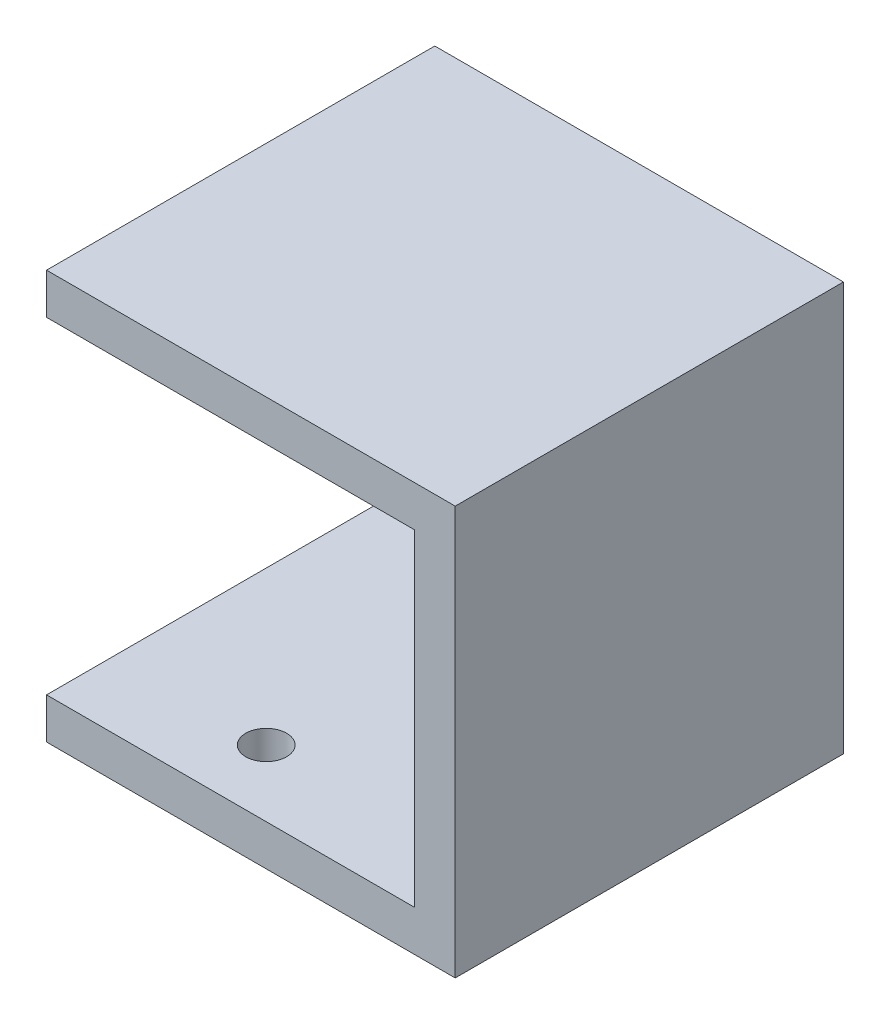
ISO-10303-21;
HEADER;
FILE_DESCRIPTION(('STEP AP214'),'2;1');
FILE_NAME('part.step','',(''),(''),'','','');
FILE_SCHEMA(('AUTOMOTIVE_DESIGN { 1 0 10303 214 1 1 1 1 }'));
ENDSEC;
DATA;
#1=APPLICATION_CONTEXT('core data for automotive mechanical design processes');
#2=APPLICATION_PROTOCOL_DEFINITION('international standard','automotive_design',2000,#1);
#3=PRODUCT_CONTEXT('',#1,'mechanical');
#4=PRODUCT('Part','Part','',(#3));
#5=PRODUCT_RELATED_PRODUCT_CATEGORY('part','',(#4));
#6=PRODUCT_DEFINITION_FORMATION('','',#4);
#7=PRODUCT_DEFINITION_CONTEXT('part definition',#1,'design');
#8=PRODUCT_DEFINITION('design','',#6,#7);
#9=PRODUCT_DEFINITION_SHAPE('','',#8);
#10=(LENGTH_UNIT() NAMED_UNIT(*) SI_UNIT(.MILLI.,.METRE.));
#11=(NAMED_UNIT(*) PLANE_ANGLE_UNIT() SI_UNIT($,.RADIAN.));
#12=(NAMED_UNIT(*) SI_UNIT($,.STERADIAN.) SOLID_ANGLE_UNIT());
#13=UNCERTAINTY_MEASURE_WITH_UNIT(LENGTH_MEASURE(1.E-05),#10,'distance_accuracy_value','');
#14=(GEOMETRIC_REPRESENTATION_CONTEXT(3) GLOBAL_UNCERTAINTY_ASSIGNED_CONTEXT((#13)) GLOBAL_UNIT_ASSIGNED_CONTEXT((#10,
#11,#12)) REPRESENTATION_CONTEXT('',''));
#15=CARTESIAN_POINT('',(0.,0.,0.));
#16=DIRECTION('',(0.,0.,1.));
#17=DIRECTION('',(1.,0.,0.));
#18=AXIS2_PLACEMENT_3D('',#15,#16,#17);
#19=CARTESIAN_POINT('',(0.,2.,38.));
#20=DIRECTION('',(0.,1.,0.));
#21=DIRECTION('',(-1.,0.,0.));
#22=AXIS2_PLACEMENT_3D('',#19,#20,#21);
#23=PLANE('',#22);
#24=DIRECTION('',(1.,0.,0.));
#25=VECTOR('',#24,1.);
#26=CARTESIAN_POINT('',(0.,2.,0.));
#27=LINE('',#26,#25);
#28=CARTESIAN_POINT('',(-20.,2.,0.));
#29=VERTEX_POINT('',#28);
#30=CARTESIAN_POINT('',(16.,2.,0.));
#31=VERTEX_POINT('',#30);
#32=EDGE_CURVE('E166',#29,#31,#27,.T.);
#33=ORIENTED_EDGE('',*,*,#32,.F.);
#34=DIRECTION('',(0.,0.,-1.));
#35=VECTOR('',#34,1.);
#36=CARTESIAN_POINT('',(-20.,2.,38.));
#37=LINE('',#36,#35);
#38=CARTESIAN_POINT('',(-20.,2.,38.));
#39=VERTEX_POINT('',#38);
#40=EDGE_CURVE('E128',#39,#29,#37,.T.);
#41=ORIENTED_EDGE('',*,*,#40,.F.);
#42=DIRECTION('',(1.,0.,0.));
#43=VECTOR('',#42,1.);
#44=CARTESIAN_POINT('',(0.,2.,38.));
#45=LINE('',#44,#43);
#46=CARTESIAN_POINT('',(16.,2.,38.));
#47=VERTEX_POINT('',#46);
#48=EDGE_CURVE('E140',#39,#47,#45,.T.);
#49=ORIENTED_EDGE('',*,*,#48,.T.);
#50=DIRECTION('',(0.,0.,-1.));
#51=VECTOR('',#50,1.);
#52=CARTESIAN_POINT('',(16.,2.,38.));
#53=LINE('',#52,#51);
#54=EDGE_CURVE('E184',#47,#31,#53,.T.);
#55=ORIENTED_EDGE('',*,*,#54,.T.);
#56=EDGE_LOOP('',(#33,#41,#49,#55));
#57=FACE_BOUND('',#56,.T.);
#58=CARTESIAN_POINT('',(-5.,2.,31.5));
#59=DIRECTION('',(0.,1.,0.));
#60=DIRECTION('',(-1.,0.,0.));
#61=AXIS2_PLACEMENT_3D('',#58,#59,#60);
#62=CIRCLE('',#61,2.);
#63=CARTESIAN_POINT('',(-7.00000000000001,2.,31.5));
#64=VERTEX_POINT('',#63);
#65=EDGE_CURVE('E219',#64,#64,#62,.T.);
#66=ORIENTED_EDGE('',*,*,#65,.F.);
#67=EDGE_LOOP('',(#66));
#68=FACE_BOUND('',#67,.T.);
#69=CARTESIAN_POINT('',(-5.,2.,6.5));
#70=DIRECTION('',(0.,1.,0.));
#71=DIRECTION('',(-1.,0.,0.));
#72=AXIS2_PLACEMENT_3D('',#69,#70,#71);
#73=CIRCLE('',#72,2.);
#74=CARTESIAN_POINT('',(-7.,2.,6.5));
#75=VERTEX_POINT('',#74);
#76=EDGE_CURVE('E155',#75,#75,#73,.F.);
#77=ORIENTED_EDGE('',*,*,#76,.T.);
#78=EDGE_LOOP('',(#77));
#79=FACE_BOUND('',#78,.T.);
#80=ADVANCED_FACE('F47',(#57,#68,#79),#23,.T.);
#81=CARTESIAN_POINT('',(0.,-2.,38.));
#82=DIRECTION('',(0.,1.,0.));
#83=DIRECTION('',(-1.,0.,0.));
#84=AXIS2_PLACEMENT_3D('',#81,#82,#83);
#85=PLANE('',#84);
#86=CARTESIAN_POINT('',(-5.,-2.,31.5));
#87=DIRECTION('',(0.,-1.,0.));
#88=DIRECTION('',(1.,0.,0.));
#89=AXIS2_PLACEMENT_3D('',#86,#87,#88);
#90=CIRCLE('',#89,2.);
#91=CARTESIAN_POINT('',(-3.,-2.,31.5));
#92=VERTEX_POINT('',#91);
#93=EDGE_CURVE('E224',#92,#92,#90,.T.);
#94=ORIENTED_EDGE('',*,*,#93,.F.);
#95=EDGE_LOOP('',(#94));
#96=FACE_BOUND('',#95,.T.);
#97=DIRECTION('',(1.,0.,0.));
#98=VECTOR('',#97,1.);
#99=CARTESIAN_POINT('',(0.,-2.,0.));
#100=LINE('',#99,#98);
#101=CARTESIAN_POINT('',(-20.,-2.,0.));
#102=VERTEX_POINT('',#101);
#103=CARTESIAN_POINT('',(20.,-2.,0.));
#104=VERTEX_POINT('',#103);
#105=EDGE_CURVE('E92',#102,#104,#100,.T.);
#106=ORIENTED_EDGE('',*,*,#105,.T.);
#107=DIRECTION('',(0.,0.,-1.));
#108=VECTOR('',#107,1.);
#109=CARTESIAN_POINT('',(20.,-2.,38.));
#110=LINE('',#109,#108);
#111=CARTESIAN_POINT('',(20.,-2.,38.));
#112=VERTEX_POINT('',#111);
#113=EDGE_CURVE('E129',#112,#104,#110,.T.);
#114=ORIENTED_EDGE('',*,*,#113,.F.);
#115=DIRECTION('',(1.,0.,0.));
#116=VECTOR('',#115,1.);
#117=CARTESIAN_POINT('',(0.,-2.,38.));
#118=LINE('',#117,#116);
#119=CARTESIAN_POINT('',(-20.,-2.,38.));
#120=VERTEX_POINT('',#119);
#121=EDGE_CURVE('E131',#120,#112,#118,.T.);
#122=ORIENTED_EDGE('',*,*,#121,.F.);
#123=DIRECTION('',(0.,0.,-1.));
#124=VECTOR('',#123,1.);
#125=CARTESIAN_POINT('',(-20.,-2.,38.));
#126=LINE('',#125,#124);
#127=EDGE_CURVE('E120',#120,#102,#126,.T.);
#128=ORIENTED_EDGE('',*,*,#127,.T.);
#129=EDGE_LOOP('',(#106,#114,#122,#128));
#130=FACE_BOUND('',#129,.T.);
#131=CARTESIAN_POINT('',(-5.,-2.,6.5));
#132=DIRECTION('',(0.,-1.,0.));
#133=DIRECTION('',(1.,0.,0.));
#134=AXIS2_PLACEMENT_3D('',#131,#132,#133);
#135=CIRCLE('',#134,2.);
#136=CARTESIAN_POINT('',(-3.,-2.,6.5));
#137=VERTEX_POINT('',#136);
#138=EDGE_CURVE('E223',#137,#137,#135,.F.);
#139=ORIENTED_EDGE('',*,*,#138,.T.);
#140=EDGE_LOOP('',(#139));
#141=FACE_BOUND('',#140,.T.);
#142=ADVANCED_FACE('F132',(#96,#130,#141),#85,.F.);
#143=CARTESIAN_POINT('',(0.,38.,38.));
#144=DIRECTION('',(0.,1.,0.));
#145=DIRECTION('',(-1.,0.,0.));
#146=AXIS2_PLACEMENT_3D('',#143,#144,#145);
#147=PLANE('',#146);
#148=DIRECTION('',(1.,0.,0.));
#149=VECTOR('',#148,1.);
#150=CARTESIAN_POINT('',(0.,38.,0.));
#151=LINE('',#150,#149);
#152=CARTESIAN_POINT('',(-20.,38.,0.));
#153=VERTEX_POINT('',#152);
#154=CARTESIAN_POINT('',(20.,38.,0.));
#155=VERTEX_POINT('',#154);
#156=EDGE_CURVE('E150',#153,#155,#151,.T.);
#157=ORIENTED_EDGE('',*,*,#156,.F.);
#158=DIRECTION('',(0.,0.,-1.));
#159=VECTOR('',#158,1.);
#160=CARTESIAN_POINT('',(-20.,38.,38.));
#161=LINE('',#160,#159);
#162=CARTESIAN_POINT('',(-20.,38.,38.));
#163=VERTEX_POINT('',#162);
#164=EDGE_CURVE('E11',#163,#153,#161,.T.);
#165=ORIENTED_EDGE('',*,*,#164,.F.);
#166=DIRECTION('',(1.,0.,0.));
#167=VECTOR('',#166,1.);
#168=CARTESIAN_POINT('',(0.,38.,38.));
#169=LINE('',#168,#167);
#170=CARTESIAN_POINT('',(20.,38.,38.));
#171=VERTEX_POINT('',#170);
#172=EDGE_CURVE('E177',#163,#171,#169,.T.);
#173=ORIENTED_EDGE('',*,*,#172,.T.);
#174=DIRECTION('',(0.,0.,-1.));
#175=VECTOR('',#174,1.);
#176=CARTESIAN_POINT('',(20.,38.,38.));
#177=LINE('',#176,#175);
#178=EDGE_CURVE('E99',#171,#155,#177,.T.);
#179=ORIENTED_EDGE('',*,*,#178,.T.);
#180=EDGE_LOOP('',(#157,#165,#173,#179));
#181=FACE_BOUND('',#180,.T.);
#182=ADVANCED_FACE('F49',(#181),#147,.T.);
#183=CARTESIAN_POINT('',(-20.,0.,38.));
#184=DIRECTION('',(1.,0.,0.));
#185=DIRECTION('',(0.,0.,-1.));
#186=AXIS2_PLACEMENT_3D('',#183,#184,#185);
#187=PLANE('',#186);
#188=DIRECTION('',(0.,-1.,0.));
#189=VECTOR('',#188,1.);
#190=CARTESIAN_POINT('',(-20.,0.,0.));
#191=LINE('',#190,#189);
#192=CARTESIAN_POINT('',(-20.,34.,0.));
#193=VERTEX_POINT('',#192);
#194=EDGE_CURVE('E154',#153,#193,#191,.T.);
#195=ORIENTED_EDGE('',*,*,#194,.T.);
#196=DIRECTION('',(0.,0.,-1.));
#197=VECTOR('',#196,1.);
#198=CARTESIAN_POINT('',(-20.,34.,38.));
#199=LINE('',#198,#197);
#200=CARTESIAN_POINT('',(-20.,34.,38.));
#201=VERTEX_POINT('',#200);
#202=EDGE_CURVE('E57',#201,#193,#199,.T.);
#203=ORIENTED_EDGE('',*,*,#202,.F.);
#204=DIRECTION('',(0.,-1.,0.));
#205=VECTOR('',#204,1.);
#206=CARTESIAN_POINT('',(-20.,0.,38.));
#207=LINE('',#206,#205);
#208=EDGE_CURVE('E209',#163,#201,#207,.T.);
#209=ORIENTED_EDGE('',*,*,#208,.F.);
#210=ORIENTED_EDGE('',*,*,#164,.T.);
#211=EDGE_LOOP('',(#195,#203,#209,#210));
#212=FACE_BOUND('',#211,.T.);
#213=ADVANCED_FACE('F258',(#212),#187,.F.);
#214=CARTESIAN_POINT('',(0.,34.,38.));
#215=DIRECTION('',(0.,1.,0.));
#216=DIRECTION('',(-1.,0.,0.));
#217=AXIS2_PLACEMENT_3D('',#214,#215,#216);
#218=PLANE('',#217);
#219=DIRECTION('',(1.,0.,0.));
#220=VECTOR('',#219,1.);
#221=CARTESIAN_POINT('',(0.,34.,0.));
#222=LINE('',#221,#220);
#223=CARTESIAN_POINT('',(16.,34.,0.));
#224=VERTEX_POINT('',#223);
#225=EDGE_CURVE('E158',#193,#224,#222,.T.);
#226=ORIENTED_EDGE('',*,*,#225,.T.);
#227=DIRECTION('',(0.,0.,-1.));
#228=VECTOR('',#227,1.);
#229=CARTESIAN_POINT('',(16.,34.,38.));
#230=LINE('',#229,#228);
#231=CARTESIAN_POINT('',(16.,34.,38.));
#232=VERTEX_POINT('',#231);
#233=EDGE_CURVE('E187',#232,#224,#230,.T.);
#234=ORIENTED_EDGE('',*,*,#233,.F.);
#235=DIRECTION('',(1.,0.,0.));
#236=VECTOR('',#235,1.);
#237=CARTESIAN_POINT('',(0.,34.,38.));
#238=LINE('',#237,#236);
#239=EDGE_CURVE('E197',#201,#232,#238,.T.);
#240=ORIENTED_EDGE('',*,*,#239,.F.);
#241=ORIENTED_EDGE('',*,*,#202,.T.);
#242=EDGE_LOOP('',(#226,#234,#240,#241));
#243=FACE_BOUND('',#242,.T.);
#244=ADVANCED_FACE('F195',(#243),#218,.F.);
#245=CARTESIAN_POINT('',(16.,0.,38.));
#246=DIRECTION('',(-1.,0.,0.));
#247=DIRECTION('',(0.,0.,1.));
#248=AXIS2_PLACEMENT_3D('',#245,#246,#247);
#249=PLANE('',#248);
#250=DIRECTION('',(0.,1.,0.));
#251=VECTOR('',#250,1.);
#252=CARTESIAN_POINT('',(16.,0.,0.));
#253=LINE('',#252,#251);
#254=EDGE_CURVE('E162',#31,#224,#253,.T.);
#255=ORIENTED_EDGE('',*,*,#254,.F.);
#256=ORIENTED_EDGE('',*,*,#54,.F.);
#257=DIRECTION('',(0.,1.,0.));
#258=VECTOR('',#257,1.);
#259=CARTESIAN_POINT('',(16.,0.,38.));
#260=LINE('',#259,#258);
#261=EDGE_CURVE('E144',#47,#232,#260,.T.);
#262=ORIENTED_EDGE('',*,*,#261,.T.);
#263=ORIENTED_EDGE('',*,*,#233,.T.);
#264=EDGE_LOOP('',(#255,#256,#262,#263));
#265=FACE_BOUND('',#264,.T.);
#266=ADVANCED_FACE('F205',(#265),#249,.T.);
#267=CARTESIAN_POINT('',(-20.,0.,38.));
#268=DIRECTION('',(-1.,0.,0.));
#269=DIRECTION('',(0.,0.,1.));
#270=AXIS2_PLACEMENT_3D('',#267,#268,#269);
#271=PLANE('',#270);
#272=DIRECTION('',(0.,1.,0.));
#273=VECTOR('',#272,1.);
#274=CARTESIAN_POINT('',(-20.,0.,0.));
#275=LINE('',#274,#273);
#276=EDGE_CURVE('E126',#102,#29,#275,.T.);
#277=ORIENTED_EDGE('',*,*,#276,.F.);
#278=ORIENTED_EDGE('',*,*,#127,.F.);
#279=DIRECTION('',(0.,1.,0.));
#280=VECTOR('',#279,1.);
#281=CARTESIAN_POINT('',(-20.,0.,38.));
#282=LINE('',#281,#280);
#283=EDGE_CURVE('E124',#120,#39,#282,.T.);
#284=ORIENTED_EDGE('',*,*,#283,.T.);
#285=ORIENTED_EDGE('',*,*,#40,.T.);
#286=EDGE_LOOP('',(#277,#278,#284,#285));
#287=FACE_BOUND('',#286,.T.);
#288=ADVANCED_FACE('F122',(#287),#271,.T.);
#289=CARTESIAN_POINT('',(20.,0.,38.));
#290=DIRECTION('',(-1.,0.,0.));
#291=DIRECTION('',(0.,0.,1.));
#292=AXIS2_PLACEMENT_3D('',#289,#290,#291);
#293=PLANE('',#292);
#294=DIRECTION('',(0.,1.,0.));
#295=VECTOR('',#294,1.);
#296=CARTESIAN_POINT('',(20.,0.,0.));
#297=LINE('',#296,#295);
#298=EDGE_CURVE('E174',#104,#155,#297,.T.);
#299=ORIENTED_EDGE('',*,*,#298,.T.);
#300=ORIENTED_EDGE('',*,*,#178,.F.);
#301=DIRECTION('',(0.,1.,0.));
#302=VECTOR('',#301,1.);
#303=CARTESIAN_POINT('',(20.,0.,38.));
#304=LINE('',#303,#302);
#305=EDGE_CURVE('E65',#112,#171,#304,.T.);
#306=ORIENTED_EDGE('',*,*,#305,.F.);
#307=ORIENTED_EDGE('',*,*,#113,.T.);
#308=EDGE_LOOP('',(#299,#300,#306,#307));
#309=FACE_BOUND('',#308,.T.);
#310=ADVANCED_FACE('F265',(#309),#293,.F.);
#311=CARTESIAN_POINT('',(0.,0.,38.));
#312=DIRECTION('',(0.,0.,1.));
#313=DIRECTION('',(1.,0.,0.));
#314=AXIS2_PLACEMENT_3D('',#311,#312,#313);
#315=PLANE('',#314);
#316=ORIENTED_EDGE('',*,*,#172,.F.);
#317=ORIENTED_EDGE('',*,*,#208,.T.);
#318=ORIENTED_EDGE('',*,*,#239,.T.);
#319=ORIENTED_EDGE('',*,*,#261,.F.);
#320=ORIENTED_EDGE('',*,*,#48,.F.);
#321=ORIENTED_EDGE('',*,*,#283,.F.);
#322=ORIENTED_EDGE('',*,*,#121,.T.);
#323=ORIENTED_EDGE('',*,*,#305,.T.);
#324=EDGE_LOOP('',(#316,#317,#318,#319,#320,#321,#322,#323));
#325=FACE_BOUND('',#324,.T.);
#326=ADVANCED_FACE('F137',(#325),#315,.T.);
#327=CARTESIAN_POINT('',(0.,0.,0.));
#328=DIRECTION('',(0.,0.,1.));
#329=DIRECTION('',(1.,0.,0.));
#330=AXIS2_PLACEMENT_3D('',#327,#328,#329);
#331=PLANE('',#330);
#332=ORIENTED_EDGE('',*,*,#156,.T.);
#333=ORIENTED_EDGE('',*,*,#298,.F.);
#334=ORIENTED_EDGE('',*,*,#105,.F.);
#335=ORIENTED_EDGE('',*,*,#276,.T.);
#336=ORIENTED_EDGE('',*,*,#32,.T.);
#337=ORIENTED_EDGE('',*,*,#254,.T.);
#338=ORIENTED_EDGE('',*,*,#225,.F.);
#339=ORIENTED_EDGE('',*,*,#194,.F.);
#340=EDGE_LOOP('',(#332,#333,#334,#335,#336,#337,#338,#339));
#341=FACE_BOUND('',#340,.T.);
#342=ADVANCED_FACE('F201',(#341),#331,.F.);
#343=CARTESIAN_POINT('',(-5.,8.,31.5));
#344=DIRECTION('',(0.,-1.,0.));
#345=DIRECTION('',(1.,0.,0.));
#346=AXIS2_PLACEMENT_3D('',#343,#344,#345);
#347=CYLINDRICAL_SURFACE('',#346,2.);
#348=ORIENTED_EDGE('',*,*,#65,.T.);
#349=EDGE_LOOP('',(#348));
#350=FACE_BOUND('',#349,.T.);
#351=ORIENTED_EDGE('',*,*,#93,.T.);
#352=EDGE_LOOP('',(#351));
#353=FACE_BOUND('',#352,.T.);
#354=ADVANCED_FACE('F234',(#350,#353),#347,.F.);
#355=CARTESIAN_POINT('',(-5.,8.,6.5));
#356=DIRECTION('',(0.,-1.,0.));
#357=DIRECTION('',(1.,0.,0.));
#358=AXIS2_PLACEMENT_3D('',#355,#356,#357);
#359=CYLINDRICAL_SURFACE('',#358,2.);
#360=ORIENTED_EDGE('',*,*,#76,.F.);
#361=EDGE_LOOP('',(#360));
#362=FACE_BOUND('',#361,.T.);
#363=ORIENTED_EDGE('',*,*,#138,.F.);
#364=EDGE_LOOP('',(#363));
#365=FACE_BOUND('',#364,.T.);
#366=ADVANCED_FACE('F232',(#362,#365),#359,.F.);
#367=CLOSED_SHELL('',(#80,#142,#182,#213,#244,#266,#288,#310,#326,#342,#354,#366));
#368=MANIFOLD_SOLID_BREP('B2',#367);
#369=ADVANCED_BREP_SHAPE_REPRESENTATION('',(#18,#368),#14);
#370=SHAPE_DEFINITION_REPRESENTATION(#9,#369);
ENDSEC;
END-ISO-10303-21;
